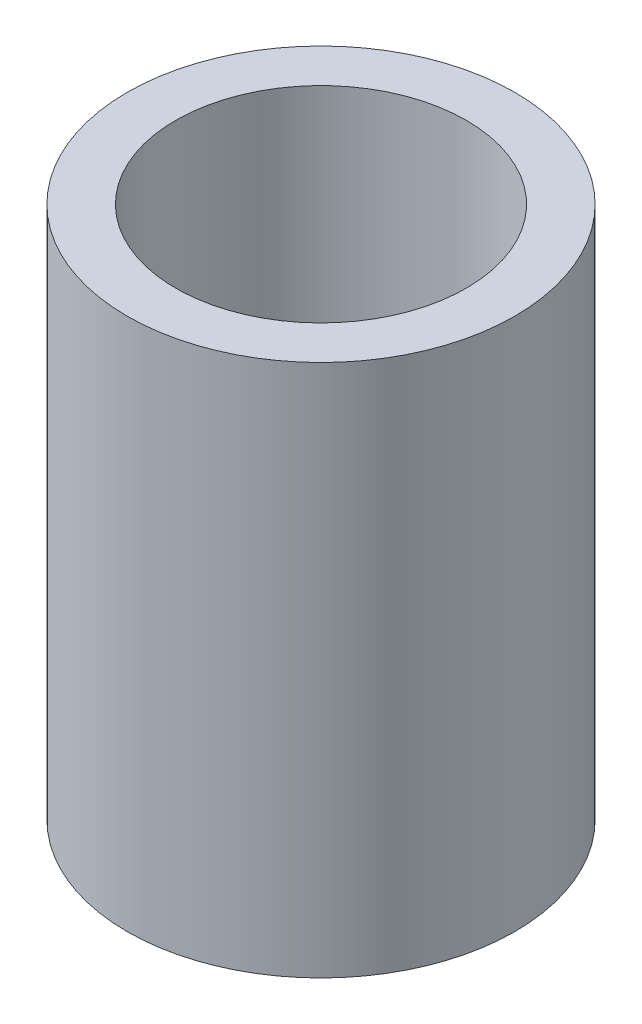
ISO-10303-21;
HEADER;
FILE_DESCRIPTION(('STEP AP214'),'2;1');
FILE_NAME('part.step','',(''),(''),'','','');
FILE_SCHEMA(('AUTOMOTIVE_DESIGN { 1 0 10303 214 1 1 1 1 }'));
ENDSEC;
DATA;
#1=APPLICATION_CONTEXT('core data for automotive mechanical design processes');
#2=APPLICATION_PROTOCOL_DEFINITION('international standard','automotive_design',2000,#1);
#3=PRODUCT_CONTEXT('',#1,'mechanical');
#4=PRODUCT('Part','Part','',(#3));
#5=PRODUCT_RELATED_PRODUCT_CATEGORY('part','',(#4));
#6=PRODUCT_DEFINITION_FORMATION('','',#4);
#7=PRODUCT_DEFINITION_CONTEXT('part definition',#1,'design');
#8=PRODUCT_DEFINITION('design','',#6,#7);
#9=PRODUCT_DEFINITION_SHAPE('','',#8);
#10=(LENGTH_UNIT() NAMED_UNIT(*) SI_UNIT(.MILLI.,.METRE.));
#11=(NAMED_UNIT(*) PLANE_ANGLE_UNIT() SI_UNIT($,.RADIAN.));
#12=(NAMED_UNIT(*) SI_UNIT($,.STERADIAN.) SOLID_ANGLE_UNIT());
#13=UNCERTAINTY_MEASURE_WITH_UNIT(LENGTH_MEASURE(1.E-05),#10,'distance_accuracy_value','');
#14=(GEOMETRIC_REPRESENTATION_CONTEXT(3) GLOBAL_UNCERTAINTY_ASSIGNED_CONTEXT((#13)) GLOBAL_UNIT_ASSIGNED_CONTEXT((#10,
#11,#12)) REPRESENTATION_CONTEXT('',''));
#15=CARTESIAN_POINT('',(0.,0.,0.));
#16=DIRECTION('',(0.,0.,1.));
#17=DIRECTION('',(1.,0.,0.));
#18=AXIS2_PLACEMENT_3D('',#15,#16,#17);
#19=CARTESIAN_POINT('',(0.,5.5,0.));
#20=DIRECTION('',(0.,1.,0.));
#21=DIRECTION('',(0.,0.,-1.));
#22=AXIS2_PLACEMENT_3D('',#19,#20,#21);
#23=PLANE('',#22);
#24=CARTESIAN_POINT('',(0.,5.5,0.));
#25=DIRECTION('',(0.,-1.,0.));
#26=DIRECTION('',(0.,0.,-1.));
#27=AXIS2_PLACEMENT_3D('',#24,#25,#26);
#28=CIRCLE('',#27,2.);
#29=CARTESIAN_POINT('',(0.,5.5,-2.));
#30=VERTEX_POINT('',#29);
#31=EDGE_CURVE('E10',#30,#30,#28,.T.);
#32=ORIENTED_EDGE('',*,*,#31,.F.);
#33=EDGE_LOOP('',(#32));
#34=FACE_BOUND('',#33,.T.);
#35=CARTESIAN_POINT('',(0.,5.5,0.));
#36=DIRECTION('',(0.,-1.,0.));
#37=DIRECTION('',(0.,0.,-1.));
#38=AXIS2_PLACEMENT_3D('',#35,#36,#37);
#39=CIRCLE('',#38,1.5);
#40=CARTESIAN_POINT('',(0.,5.5,-1.5));
#41=VERTEX_POINT('',#40);
#42=EDGE_CURVE('E39',#41,#41,#39,.T.);
#43=ORIENTED_EDGE('',*,*,#42,.T.);
#44=EDGE_LOOP('',(#43));
#45=FACE_BOUND('',#44,.T.);
#46=ADVANCED_FACE('F28',(#34,#45),#23,.T.);
#47=CARTESIAN_POINT('',(0.,0.,0.));
#48=DIRECTION('',(0.,1.,0.));
#49=DIRECTION('',(0.,0.,-1.));
#50=AXIS2_PLACEMENT_3D('',#47,#48,#49);
#51=PLANE('',#50);
#52=CARTESIAN_POINT('',(0.,0.,0.));
#53=DIRECTION('',(0.,-1.,0.));
#54=DIRECTION('',(0.,0.,-1.));
#55=AXIS2_PLACEMENT_3D('',#52,#53,#54);
#56=CIRCLE('',#55,2.);
#57=CARTESIAN_POINT('',(0.,0.,-2.));
#58=VERTEX_POINT('',#57);
#59=EDGE_CURVE('E32',#58,#58,#56,.T.);
#60=ORIENTED_EDGE('',*,*,#59,.T.);
#61=EDGE_LOOP('',(#60));
#62=FACE_BOUND('',#61,.T.);
#63=CARTESIAN_POINT('',(0.,0.,0.));
#64=DIRECTION('',(0.,-1.,0.));
#65=DIRECTION('',(0.,0.,-1.));
#66=AXIS2_PLACEMENT_3D('',#63,#64,#65);
#67=CIRCLE('',#66,1.5);
#68=CARTESIAN_POINT('',(0.,0.,-1.5));
#69=VERTEX_POINT('',#68);
#70=EDGE_CURVE('E41',#69,#69,#67,.T.);
#71=ORIENTED_EDGE('',*,*,#70,.F.);
#72=EDGE_LOOP('',(#71));
#73=FACE_BOUND('',#72,.T.);
#74=ADVANCED_FACE('F54',(#62,#73),#51,.F.);
#75=CARTESIAN_POINT('',(0.,5.5,0.));
#76=DIRECTION('',(0.,-1.,0.));
#77=DIRECTION('',(0.,0.,1.));
#78=AXIS2_PLACEMENT_3D('',#75,#76,#77);
#79=CYLINDRICAL_SURFACE('',#78,2.);
#80=ORIENTED_EDGE('',*,*,#31,.T.);
#81=EDGE_LOOP('',(#80));
#82=FACE_BOUND('',#81,.T.);
#83=ORIENTED_EDGE('',*,*,#59,.F.);
#84=EDGE_LOOP('',(#83));
#85=FACE_BOUND('',#84,.T.);
#86=ADVANCED_FACE('F30',(#82,#85),#79,.T.);
#87=CARTESIAN_POINT('',(0.,5.5,0.));
#88=DIRECTION('',(0.,-1.,0.));
#89=DIRECTION('',(0.,0.,1.));
#90=AXIS2_PLACEMENT_3D('',#87,#88,#89);
#91=CYLINDRICAL_SURFACE('',#90,1.5);
#92=ORIENTED_EDGE('',*,*,#42,.F.);
#93=EDGE_LOOP('',(#92));
#94=FACE_BOUND('',#93,.T.);
#95=ORIENTED_EDGE('',*,*,#70,.T.);
#96=EDGE_LOOP('',(#95));
#97=FACE_BOUND('',#96,.T.);
#98=ADVANCED_FACE('F48',(#94,#97),#91,.F.);
#99=CLOSED_SHELL('',(#46,#74,#86,#98));
#100=MANIFOLD_SOLID_BREP('B2',#99);
#101=ADVANCED_BREP_SHAPE_REPRESENTATION('',(#18,#100),#14);
#102=SHAPE_DEFINITION_REPRESENTATION(#9,#101);
ENDSEC;
END-ISO-10303-21;
